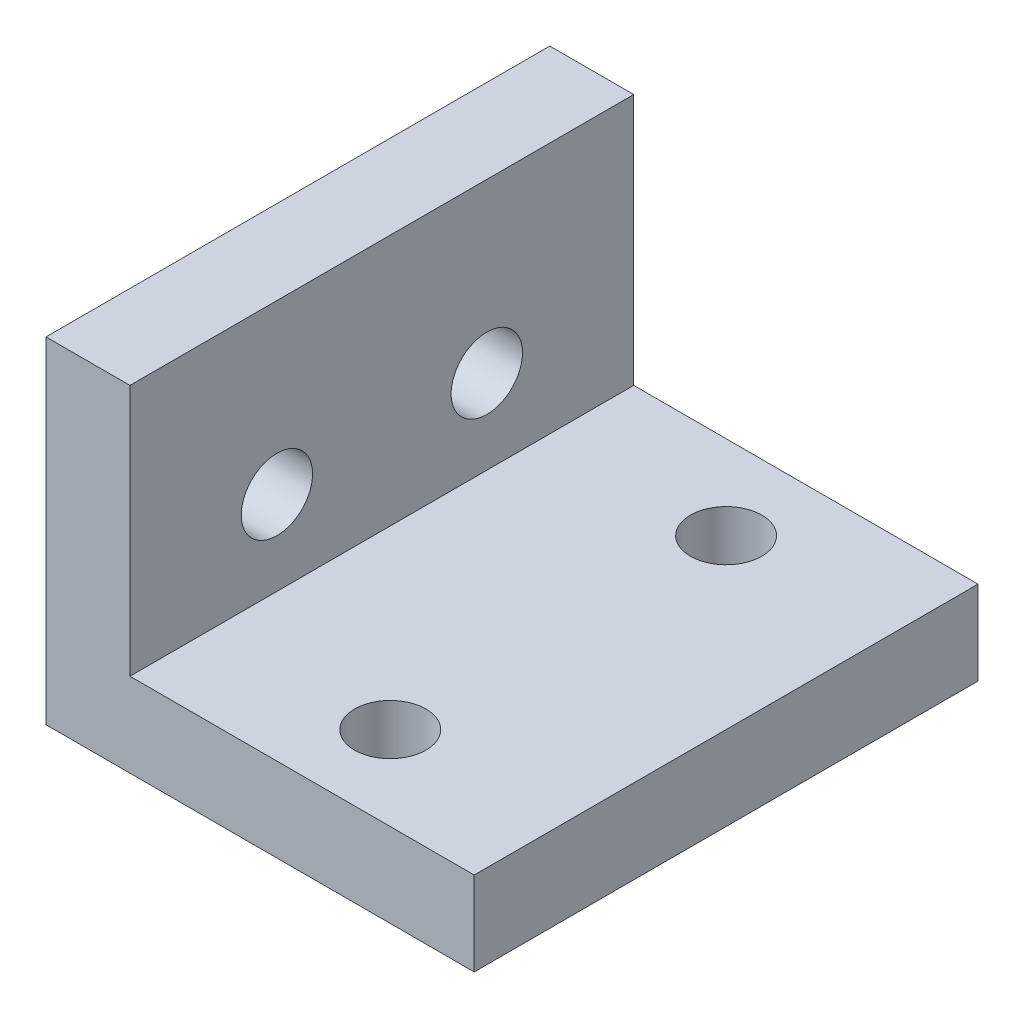
ISO-10303-21;
HEADER;
FILE_DESCRIPTION(('STEP AP214'),'2;1');
FILE_NAME('part.step','',(''),(''),'','','');
FILE_SCHEMA(('AUTOMOTIVE_DESIGN { 1 0 10303 214 1 1 1 1 }'));
ENDSEC;
DATA;
#1=APPLICATION_CONTEXT('core data for automotive mechanical design processes');
#2=APPLICATION_PROTOCOL_DEFINITION('international standard','automotive_design',2000,#1);
#3=PRODUCT_CONTEXT('',#1,'mechanical');
#4=PRODUCT('Part','Part','',(#3));
#5=PRODUCT_RELATED_PRODUCT_CATEGORY('part','',(#4));
#6=PRODUCT_DEFINITION_FORMATION('','',#4);
#7=PRODUCT_DEFINITION_CONTEXT('part definition',#1,'design');
#8=PRODUCT_DEFINITION('design','',#6,#7);
#9=PRODUCT_DEFINITION_SHAPE('','',#8);
#10=(LENGTH_UNIT() NAMED_UNIT(*) SI_UNIT(.MILLI.,.METRE.));
#11=(NAMED_UNIT(*) PLANE_ANGLE_UNIT() SI_UNIT($,.RADIAN.));
#12=(NAMED_UNIT(*) SI_UNIT($,.STERADIAN.) SOLID_ANGLE_UNIT());
#13=UNCERTAINTY_MEASURE_WITH_UNIT(LENGTH_MEASURE(1.E-05),#10,'distance_accuracy_value','');
#14=(GEOMETRIC_REPRESENTATION_CONTEXT(3) GLOBAL_UNCERTAINTY_ASSIGNED_CONTEXT((#13)) GLOBAL_UNIT_ASSIGNED_CONTEXT((#10,
#11,#12)) REPRESENTATION_CONTEXT('',''));
#15=CARTESIAN_POINT('',(0.,0.,0.));
#16=DIRECTION('',(0.,0.,1.));
#17=DIRECTION('',(1.,0.,0.));
#18=AXIS2_PLACEMENT_3D('',#15,#16,#17);
#19=CARTESIAN_POINT('',(10.,40.,60.));
#20=DIRECTION('',(0.,-1.,0.));
#21=DIRECTION('',(0.,0.,-1.));
#22=AXIS2_PLACEMENT_3D('',#19,#20,#21);
#23=PLANE('',#22);
#24=DIRECTION('',(-1.,0.,0.));
#25=VECTOR('',#24,1.);
#26=CARTESIAN_POINT('',(10.,40.,0.));
#27=LINE('',#26,#25);
#28=CARTESIAN_POINT('',(10.,40.,0.));
#29=VERTEX_POINT('',#28);
#30=CARTESIAN_POINT('',(0.,40.,0.));
#31=VERTEX_POINT('',#30);
#32=EDGE_CURVE('E121',#29,#31,#27,.T.);
#33=ORIENTED_EDGE('',*,*,#32,.T.);
#34=DIRECTION('',(0.,0.,-1.));
#35=VECTOR('',#34,1.);
#36=CARTESIAN_POINT('',(0.,40.,60.));
#37=LINE('',#36,#35);
#38=CARTESIAN_POINT('',(0.,40.,60.));
#39=VERTEX_POINT('',#38);
#40=EDGE_CURVE('E11',#39,#31,#37,.T.);
#41=ORIENTED_EDGE('',*,*,#40,.F.);
#42=DIRECTION('',(-1.,0.,0.));
#43=VECTOR('',#42,1.);
#44=CARTESIAN_POINT('',(10.,40.,60.));
#45=LINE('',#44,#43);
#46=CARTESIAN_POINT('',(10.,40.,60.));
#47=VERTEX_POINT('',#46);
#48=EDGE_CURVE('E132',#47,#39,#45,.T.);
#49=ORIENTED_EDGE('',*,*,#48,.F.);
#50=DIRECTION('',(0.,0.,-1.));
#51=VECTOR('',#50,1.);
#52=CARTESIAN_POINT('',(10.,40.,60.));
#53=LINE('',#52,#51);
#54=EDGE_CURVE('E117',#47,#29,#53,.T.);
#55=ORIENTED_EDGE('',*,*,#54,.T.);
#56=EDGE_LOOP('',(#33,#41,#49,#55));
#57=FACE_BOUND('',#56,.T.);
#58=ADVANCED_FACE('F37',(#57),#23,.F.);
#59=CARTESIAN_POINT('',(0.,40.,60.));
#60=DIRECTION('',(1.,0.,0.));
#61=DIRECTION('',(0.,1.,0.));
#62=AXIS2_PLACEMENT_3D('',#59,#60,#61);
#63=PLANE('',#62);
#64=CARTESIAN_POINT('',(0.,20.,42.5));
#65=DIRECTION('',(1.,0.,0.));
#66=DIRECTION('',(0.,0.,-1.));
#67=AXIS2_PLACEMENT_3D('',#64,#65,#66);
#68=CIRCLE('',#67,4.25);
#69=CARTESIAN_POINT('',(0.,20.,38.25));
#70=VERTEX_POINT('',#69);
#71=EDGE_CURVE('E267',#70,#70,#68,.T.);
#72=ORIENTED_EDGE('',*,*,#71,.T.);
#73=EDGE_LOOP('',(#72));
#74=FACE_BOUND('',#73,.T.);
#75=CARTESIAN_POINT('',(0.,20.,17.5));
#76=DIRECTION('',(1.,0.,0.));
#77=DIRECTION('',(0.,0.,-1.));
#78=AXIS2_PLACEMENT_3D('',#75,#76,#77);
#79=CIRCLE('',#78,4.25);
#80=CARTESIAN_POINT('',(0.,20.,13.25));
#81=VERTEX_POINT('',#80);
#82=EDGE_CURVE('E276',#81,#81,#79,.T.);
#83=ORIENTED_EDGE('',*,*,#82,.T.);
#84=EDGE_LOOP('',(#83));
#85=FACE_BOUND('',#84,.T.);
#86=DIRECTION('',(0.,-1.,0.));
#87=VECTOR('',#86,1.);
#88=CARTESIAN_POINT('',(0.,40.,0.));
#89=LINE('',#88,#87);
#90=CARTESIAN_POINT('',(0.,0.,0.));
#91=VERTEX_POINT('',#90);
#92=EDGE_CURVE('E124',#31,#91,#89,.T.);
#93=ORIENTED_EDGE('',*,*,#92,.T.);
#94=DIRECTION('',(0.,0.,-1.));
#95=VECTOR('',#94,1.);
#96=CARTESIAN_POINT('',(0.,0.,60.));
#97=LINE('',#96,#95);
#98=CARTESIAN_POINT('',(0.,0.,60.));
#99=VERTEX_POINT('',#98);
#100=EDGE_CURVE('E45',#99,#91,#97,.T.);
#101=ORIENTED_EDGE('',*,*,#100,.F.);
#102=DIRECTION('',(0.,-1.,0.));
#103=VECTOR('',#102,1.);
#104=CARTESIAN_POINT('',(0.,40.,60.));
#105=LINE('',#104,#103);
#106=EDGE_CURVE('E90',#39,#99,#105,.T.);
#107=ORIENTED_EDGE('',*,*,#106,.F.);
#108=ORIENTED_EDGE('',*,*,#40,.T.);
#109=EDGE_LOOP('',(#93,#101,#107,#108));
#110=FACE_BOUND('',#109,.T.);
#111=ADVANCED_FACE('F160',(#74,#85,#110),#63,.F.);
#112=CARTESIAN_POINT('',(0.,0.,60.));
#113=DIRECTION('',(0.,1.,0.));
#114=DIRECTION('',(0.,0.,1.));
#115=AXIS2_PLACEMENT_3D('',#112,#113,#114);
#116=PLANE('',#115);
#117=CARTESIAN_POINT('',(31.,0.,50.));
#118=DIRECTION('',(0.,1.,0.));
#119=DIRECTION('',(0.,0.,1.));
#120=AXIS2_PLACEMENT_3D('',#117,#118,#119);
#121=CIRCLE('',#120,4.25);
#122=CARTESIAN_POINT('',(31.,0.,54.25));
#123=VERTEX_POINT('',#122);
#124=EDGE_CURVE('E282',#123,#123,#121,.T.);
#125=ORIENTED_EDGE('',*,*,#124,.T.);
#126=EDGE_LOOP('',(#125));
#127=FACE_BOUND('',#126,.T.);
#128=CARTESIAN_POINT('',(31.,0.,9.99999999999999));
#129=DIRECTION('',(0.,1.,0.));
#130=DIRECTION('',(0.,0.,1.));
#131=AXIS2_PLACEMENT_3D('',#128,#129,#130);
#132=CIRCLE('',#131,4.25);
#133=CARTESIAN_POINT('',(31.,0.,14.25));
#134=VERTEX_POINT('',#133);
#135=EDGE_CURVE('E125',#134,#134,#132,.T.);
#136=ORIENTED_EDGE('',*,*,#135,.T.);
#137=EDGE_LOOP('',(#136));
#138=FACE_BOUND('',#137,.T.);
#139=DIRECTION('',(1.,0.,0.));
#140=VECTOR('',#139,1.);
#141=CARTESIAN_POINT('',(0.,0.,0.));
#142=LINE('',#141,#140);
#143=CARTESIAN_POINT('',(51.,0.,0.));
#144=VERTEX_POINT('',#143);
#145=EDGE_CURVE('E127',#91,#144,#142,.T.);
#146=ORIENTED_EDGE('',*,*,#145,.T.);
#147=DIRECTION('',(0.,0.,-1.));
#148=VECTOR('',#147,1.);
#149=CARTESIAN_POINT('',(51.,0.,60.));
#150=LINE('',#149,#148);
#151=CARTESIAN_POINT('',(51.,0.,60.));
#152=VERTEX_POINT('',#151);
#153=EDGE_CURVE('E112',#152,#144,#150,.T.);
#154=ORIENTED_EDGE('',*,*,#153,.F.);
#155=DIRECTION('',(1.,0.,0.));
#156=VECTOR('',#155,1.);
#157=CARTESIAN_POINT('',(0.,0.,60.));
#158=LINE('',#157,#156);
#159=EDGE_CURVE('E103',#99,#152,#158,.T.);
#160=ORIENTED_EDGE('',*,*,#159,.F.);
#161=ORIENTED_EDGE('',*,*,#100,.T.);
#162=EDGE_LOOP('',(#146,#154,#160,#161));
#163=FACE_BOUND('',#162,.T.);
#164=ADVANCED_FACE('F138',(#127,#138,#163),#116,.F.);
#165=CARTESIAN_POINT('',(51.,0.,60.));
#166=DIRECTION('',(-1.,0.,0.));
#167=DIRECTION('',(0.,0.,1.));
#168=AXIS2_PLACEMENT_3D('',#165,#166,#167);
#169=PLANE('',#168);
#170=DIRECTION('',(0.,1.,0.));
#171=VECTOR('',#170,1.);
#172=CARTESIAN_POINT('',(51.,0.,0.));
#173=LINE('',#172,#171);
#174=CARTESIAN_POINT('',(51.,10.,0.));
#175=VERTEX_POINT('',#174);
#176=EDGE_CURVE('E111',#144,#175,#173,.T.);
#177=ORIENTED_EDGE('',*,*,#176,.T.);
#178=DIRECTION('',(0.,0.,-1.));
#179=VECTOR('',#178,1.);
#180=CARTESIAN_POINT('',(51.,10.,60.));
#181=LINE('',#180,#179);
#182=CARTESIAN_POINT('',(51.,10.,60.));
#183=VERTEX_POINT('',#182);
#184=EDGE_CURVE('E108',#183,#175,#181,.T.);
#185=ORIENTED_EDGE('',*,*,#184,.F.);
#186=DIRECTION('',(0.,1.,0.));
#187=VECTOR('',#186,1.);
#188=CARTESIAN_POINT('',(51.,0.,60.));
#189=LINE('',#188,#187);
#190=EDGE_CURVE('E97',#152,#183,#189,.T.);
#191=ORIENTED_EDGE('',*,*,#190,.F.);
#192=ORIENTED_EDGE('',*,*,#153,.T.);
#193=EDGE_LOOP('',(#177,#185,#191,#192));
#194=FACE_BOUND('',#193,.T.);
#195=ADVANCED_FACE('F109',(#194),#169,.F.);
#196=CARTESIAN_POINT('',(51.,10.,60.));
#197=DIRECTION('',(0.,-1.,0.));
#198=DIRECTION('',(1.,0.,0.));
#199=AXIS2_PLACEMENT_3D('',#196,#197,#198);
#200=PLANE('',#199);
#201=CARTESIAN_POINT('',(31.,10.,50.));
#202=DIRECTION('',(0.,1.,0.));
#203=DIRECTION('',(0.,0.,1.));
#204=AXIS2_PLACEMENT_3D('',#201,#202,#203);
#205=CIRCLE('',#204,4.25);
#206=CARTESIAN_POINT('',(31.,10.,54.25));
#207=VERTEX_POINT('',#206);
#208=EDGE_CURVE('E279',#207,#207,#205,.T.);
#209=ORIENTED_EDGE('',*,*,#208,.F.);
#210=EDGE_LOOP('',(#209));
#211=FACE_BOUND('',#210,.T.);
#212=CARTESIAN_POINT('',(31.,10.,9.99999999999999));
#213=DIRECTION('',(0.,1.,0.));
#214=DIRECTION('',(0.,0.,1.));
#215=AXIS2_PLACEMENT_3D('',#212,#213,#214);
#216=CIRCLE('',#215,4.25);
#217=CARTESIAN_POINT('',(31.,10.,14.25));
#218=VERTEX_POINT('',#217);
#219=EDGE_CURVE('E285',#218,#218,#216,.T.);
#220=ORIENTED_EDGE('',*,*,#219,.F.);
#221=EDGE_LOOP('',(#220));
#222=FACE_BOUND('',#221,.T.);
#223=DIRECTION('',(-1.,0.,0.));
#224=VECTOR('',#223,1.);
#225=CARTESIAN_POINT('',(51.,10.,0.));
#226=LINE('',#225,#224);
#227=CARTESIAN_POINT('',(10.,10.,0.));
#228=VERTEX_POINT('',#227);
#229=EDGE_CURVE('E76',#175,#228,#226,.T.);
#230=ORIENTED_EDGE('',*,*,#229,.T.);
#231=DIRECTION('',(0.,0.,-1.));
#232=VECTOR('',#231,1.);
#233=CARTESIAN_POINT('',(10.,10.,60.));
#234=LINE('',#233,#232);
#235=CARTESIAN_POINT('',(10.,10.,60.));
#236=VERTEX_POINT('',#235);
#237=EDGE_CURVE('E113',#236,#228,#234,.T.);
#238=ORIENTED_EDGE('',*,*,#237,.F.);
#239=DIRECTION('',(-1.,0.,0.));
#240=VECTOR('',#239,1.);
#241=CARTESIAN_POINT('',(51.,10.,60.));
#242=LINE('',#241,#240);
#243=EDGE_CURVE('E101',#183,#236,#242,.T.);
#244=ORIENTED_EDGE('',*,*,#243,.F.);
#245=ORIENTED_EDGE('',*,*,#184,.T.);
#246=EDGE_LOOP('',(#230,#238,#244,#245));
#247=FACE_BOUND('',#246,.T.);
#248=ADVANCED_FACE('F115',(#211,#222,#247),#200,.F.);
#249=CARTESIAN_POINT('',(10.,10.,60.));
#250=DIRECTION('',(-1.,0.,0.));
#251=DIRECTION('',(0.,0.,1.));
#252=AXIS2_PLACEMENT_3D('',#249,#250,#251);
#253=PLANE('',#252);
#254=CARTESIAN_POINT('',(10.,20.,42.5));
#255=DIRECTION('',(1.,0.,0.));
#256=DIRECTION('',(0.,0.,-1.));
#257=AXIS2_PLACEMENT_3D('',#254,#255,#256);
#258=CIRCLE('',#257,4.25);
#259=CARTESIAN_POINT('',(10.,20.,38.25));
#260=VERTEX_POINT('',#259);
#261=EDGE_CURVE('E269',#260,#260,#258,.T.);
#262=ORIENTED_EDGE('',*,*,#261,.F.);
#263=EDGE_LOOP('',(#262));
#264=FACE_BOUND('',#263,.T.);
#265=CARTESIAN_POINT('',(10.,20.,17.5));
#266=DIRECTION('',(1.,0.,0.));
#267=DIRECTION('',(0.,0.,-1.));
#268=AXIS2_PLACEMENT_3D('',#265,#266,#267);
#269=CIRCLE('',#268,4.25);
#270=CARTESIAN_POINT('',(10.,20.,13.25));
#271=VERTEX_POINT('',#270);
#272=EDGE_CURVE('E271',#271,#271,#269,.T.);
#273=ORIENTED_EDGE('',*,*,#272,.F.);
#274=EDGE_LOOP('',(#273));
#275=FACE_BOUND('',#274,.T.);
#276=DIRECTION('',(0.,1.,0.));
#277=VECTOR('',#276,1.);
#278=CARTESIAN_POINT('',(10.,10.,0.));
#279=LINE('',#278,#277);
#280=EDGE_CURVE('E82',#228,#29,#279,.T.);
#281=ORIENTED_EDGE('',*,*,#280,.T.);
#282=ORIENTED_EDGE('',*,*,#54,.F.);
#283=DIRECTION('',(0.,1.,0.));
#284=VECTOR('',#283,1.);
#285=CARTESIAN_POINT('',(10.,10.,60.));
#286=LINE('',#285,#284);
#287=EDGE_CURVE('E53',#236,#47,#286,.T.);
#288=ORIENTED_EDGE('',*,*,#287,.F.);
#289=ORIENTED_EDGE('',*,*,#237,.T.);
#290=EDGE_LOOP('',(#281,#282,#288,#289));
#291=FACE_BOUND('',#290,.T.);
#292=ADVANCED_FACE('F145',(#264,#275,#291),#253,.F.);
#293=CARTESIAN_POINT('',(0.,0.,60.));
#294=DIRECTION('',(0.,0.,1.));
#295=DIRECTION('',(1.,0.,0.));
#296=AXIS2_PLACEMENT_3D('',#293,#294,#295);
#297=PLANE('',#296);
#298=ORIENTED_EDGE('',*,*,#48,.T.);
#299=ORIENTED_EDGE('',*,*,#106,.T.);
#300=ORIENTED_EDGE('',*,*,#159,.T.);
#301=ORIENTED_EDGE('',*,*,#190,.T.);
#302=ORIENTED_EDGE('',*,*,#243,.T.);
#303=ORIENTED_EDGE('',*,*,#287,.T.);
#304=EDGE_LOOP('',(#298,#299,#300,#301,#302,#303));
#305=FACE_BOUND('',#304,.T.);
#306=ADVANCED_FACE('F99',(#305),#297,.T.);
#307=CARTESIAN_POINT('',(0.,0.,0.));
#308=DIRECTION('',(0.,0.,1.));
#309=DIRECTION('',(1.,0.,0.));
#310=AXIS2_PLACEMENT_3D('',#307,#308,#309);
#311=PLANE('',#310);
#312=ORIENTED_EDGE('',*,*,#32,.F.);
#313=ORIENTED_EDGE('',*,*,#280,.F.);
#314=ORIENTED_EDGE('',*,*,#229,.F.);
#315=ORIENTED_EDGE('',*,*,#176,.F.);
#316=ORIENTED_EDGE('',*,*,#145,.F.);
#317=ORIENTED_EDGE('',*,*,#92,.F.);
#318=EDGE_LOOP('',(#312,#313,#314,#315,#316,#317));
#319=FACE_BOUND('',#318,.T.);
#320=ADVANCED_FACE('F141',(#319),#311,.F.);
#321=CARTESIAN_POINT('',(31.,10.,9.99999999999999));
#322=DIRECTION('',(0.,1.,0.));
#323=DIRECTION('',(0.,0.,1.));
#324=AXIS2_PLACEMENT_3D('',#321,#322,#323);
#325=CYLINDRICAL_SURFACE('',#324,4.25);
#326=ORIENTED_EDGE('',*,*,#135,.F.);
#327=EDGE_LOOP('',(#326));
#328=FACE_BOUND('',#327,.T.);
#329=ORIENTED_EDGE('',*,*,#219,.T.);
#330=EDGE_LOOP('',(#329));
#331=FACE_BOUND('',#330,.T.);
#332=ADVANCED_FACE('F195',(#328,#331),#325,.F.);
#333=CARTESIAN_POINT('',(31.,10.,50.));
#334=DIRECTION('',(0.,1.,0.));
#335=DIRECTION('',(0.,0.,1.));
#336=AXIS2_PLACEMENT_3D('',#333,#334,#335);
#337=CYLINDRICAL_SURFACE('',#336,4.25);
#338=ORIENTED_EDGE('',*,*,#124,.F.);
#339=EDGE_LOOP('',(#338));
#340=FACE_BOUND('',#339,.T.);
#341=ORIENTED_EDGE('',*,*,#208,.T.);
#342=EDGE_LOOP('',(#341));
#343=FACE_BOUND('',#342,.T.);
#344=ADVANCED_FACE('F201',(#340,#343),#337,.F.);
#345=CARTESIAN_POINT('',(10.,20.,17.5));
#346=DIRECTION('',(1.,0.,0.));
#347=DIRECTION('',(0.,0.,-1.));
#348=AXIS2_PLACEMENT_3D('',#345,#346,#347);
#349=CYLINDRICAL_SURFACE('',#348,4.25);
#350=ORIENTED_EDGE('',*,*,#82,.F.);
#351=EDGE_LOOP('',(#350));
#352=FACE_BOUND('',#351,.T.);
#353=ORIENTED_EDGE('',*,*,#272,.T.);
#354=EDGE_LOOP('',(#353));
#355=FACE_BOUND('',#354,.T.);
#356=ADVANCED_FACE('F213',(#352,#355),#349,.F.);
#357=CARTESIAN_POINT('',(10.,20.,42.5));
#358=DIRECTION('',(1.,0.,0.));
#359=DIRECTION('',(0.,0.,-1.));
#360=AXIS2_PLACEMENT_3D('',#357,#358,#359);
#361=CYLINDRICAL_SURFACE('',#360,4.25);
#362=ORIENTED_EDGE('',*,*,#71,.F.);
#363=EDGE_LOOP('',(#362));
#364=FACE_BOUND('',#363,.T.);
#365=ORIENTED_EDGE('',*,*,#261,.T.);
#366=EDGE_LOOP('',(#365));
#367=FACE_BOUND('',#366,.T.);
#368=ADVANCED_FACE('F224',(#364,#367),#361,.F.);
#369=CLOSED_SHELL('',(#58,#111,#164,#195,#248,#292,#306,#320,#332,#344,#356,#368));
#370=MANIFOLD_SOLID_BREP('B2',#369);
#371=ADVANCED_BREP_SHAPE_REPRESENTATION('',(#18,#370),#14);
#372=SHAPE_DEFINITION_REPRESENTATION(#9,#371);
ENDSEC;
END-ISO-10303-21;
